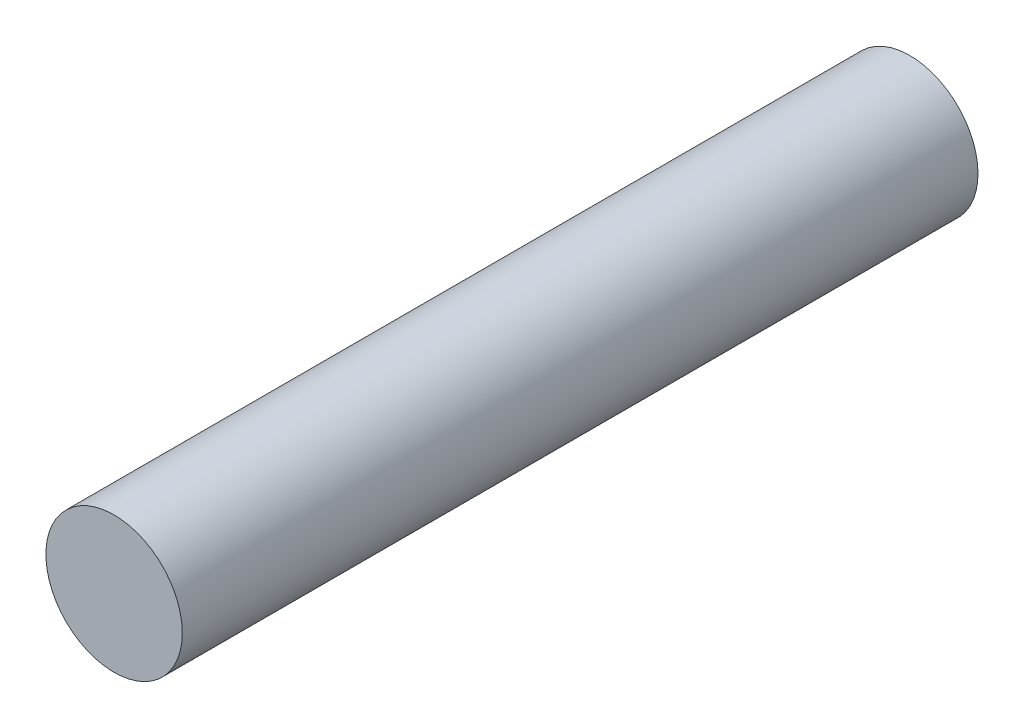
ISO-10303-21;
HEADER;
FILE_DESCRIPTION(('STEP AP214'),'2;1');
FILE_NAME('part.step','',(''),(''),'','','');
FILE_SCHEMA(('AUTOMOTIVE_DESIGN { 1 0 10303 214 1 1 1 1 }'));
ENDSEC;
DATA;
#1=APPLICATION_CONTEXT('core data for automotive mechanical design processes');
#2=APPLICATION_PROTOCOL_DEFINITION('international standard','automotive_design',2000,#1);
#3=PRODUCT_CONTEXT('',#1,'mechanical');
#4=PRODUCT('Part','Part','',(#3));
#5=PRODUCT_RELATED_PRODUCT_CATEGORY('part','',(#4));
#6=PRODUCT_DEFINITION_FORMATION('','',#4);
#7=PRODUCT_DEFINITION_CONTEXT('part definition',#1,'design');
#8=PRODUCT_DEFINITION('design','',#6,#7);
#9=PRODUCT_DEFINITION_SHAPE('','',#8);
#10=(LENGTH_UNIT() NAMED_UNIT(*) SI_UNIT(.MILLI.,.METRE.));
#11=(NAMED_UNIT(*) PLANE_ANGLE_UNIT() SI_UNIT($,.RADIAN.));
#12=(NAMED_UNIT(*) SI_UNIT($,.STERADIAN.) SOLID_ANGLE_UNIT());
#13=UNCERTAINTY_MEASURE_WITH_UNIT(LENGTH_MEASURE(1.E-05),#10,'distance_accuracy_value','');
#14=(GEOMETRIC_REPRESENTATION_CONTEXT(3) GLOBAL_UNCERTAINTY_ASSIGNED_CONTEXT((#13)) GLOBAL_UNIT_ASSIGNED_CONTEXT((#10,
#11,#12)) REPRESENTATION_CONTEXT('',''));
#15=CARTESIAN_POINT('',(0.,0.,0.));
#16=DIRECTION('',(0.,0.,1.));
#17=DIRECTION('',(1.,0.,0.));
#18=AXIS2_PLACEMENT_3D('',#15,#16,#17);
#19=CARTESIAN_POINT('',(0.,0.,17.5));
#20=DIRECTION('',(0.,0.,-1.));
#21=DIRECTION('',(-1.,0.,0.));
#22=AXIS2_PLACEMENT_3D('',#19,#20,#21);
#23=CYLINDRICAL_SURFACE('',#22,3.);
#24=CARTESIAN_POINT('',(0.,0.,17.5));
#25=DIRECTION('',(0.,0.,1.));
#26=DIRECTION('',(1.,0.,0.));
#27=AXIS2_PLACEMENT_3D('',#24,#25,#26);
#28=CIRCLE('',#27,3.);
#29=CARTESIAN_POINT('',(3.,0.,17.5));
#30=VERTEX_POINT('',#29);
#31=EDGE_CURVE('E10',#30,#30,#28,.T.);
#32=ORIENTED_EDGE('',*,*,#31,.F.);
#33=EDGE_LOOP('',(#32));
#34=FACE_BOUND('',#33,.T.);
#35=CARTESIAN_POINT('',(0.,0.,-17.5));
#36=DIRECTION('',(0.,0.,1.));
#37=DIRECTION('',(1.,0.,0.));
#38=AXIS2_PLACEMENT_3D('',#35,#36,#37);
#39=CIRCLE('',#38,3.);
#40=CARTESIAN_POINT('',(3.,0.,-17.5));
#41=VERTEX_POINT('',#40);
#42=EDGE_CURVE('E33',#41,#41,#39,.T.);
#43=ORIENTED_EDGE('',*,*,#42,.T.);
#44=EDGE_LOOP('',(#43));
#45=FACE_BOUND('',#44,.T.);
#46=ADVANCED_FACE('F30',(#34,#45),#23,.T.);
#47=CARTESIAN_POINT('',(0.,0.,17.5));
#48=DIRECTION('',(0.,0.,1.));
#49=DIRECTION('',(1.,0.,0.));
#50=AXIS2_PLACEMENT_3D('',#47,#48,#49);
#51=PLANE('',#50);
#52=ORIENTED_EDGE('',*,*,#31,.T.);
#53=EDGE_LOOP('',(#52));
#54=FACE_BOUND('',#53,.T.);
#55=ADVANCED_FACE('F45',(#54),#51,.T.);
#56=CARTESIAN_POINT('',(0.,0.,-17.5));
#57=DIRECTION('',(0.,0.,1.));
#58=DIRECTION('',(1.,0.,0.));
#59=AXIS2_PLACEMENT_3D('',#56,#57,#58);
#60=PLANE('',#59);
#61=ORIENTED_EDGE('',*,*,#42,.F.);
#62=EDGE_LOOP('',(#61));
#63=FACE_BOUND('',#62,.T.);
#64=ADVANCED_FACE('F43',(#63),#60,.F.);
#65=CLOSED_SHELL('',(#46,#55,#64));
#66=MANIFOLD_SOLID_BREP('B2',#65);
#67=ADVANCED_BREP_SHAPE_REPRESENTATION('',(#18,#66),#14);
#68=SHAPE_DEFINITION_REPRESENTATION(#9,#67);
ENDSEC;
END-ISO-10303-21;
